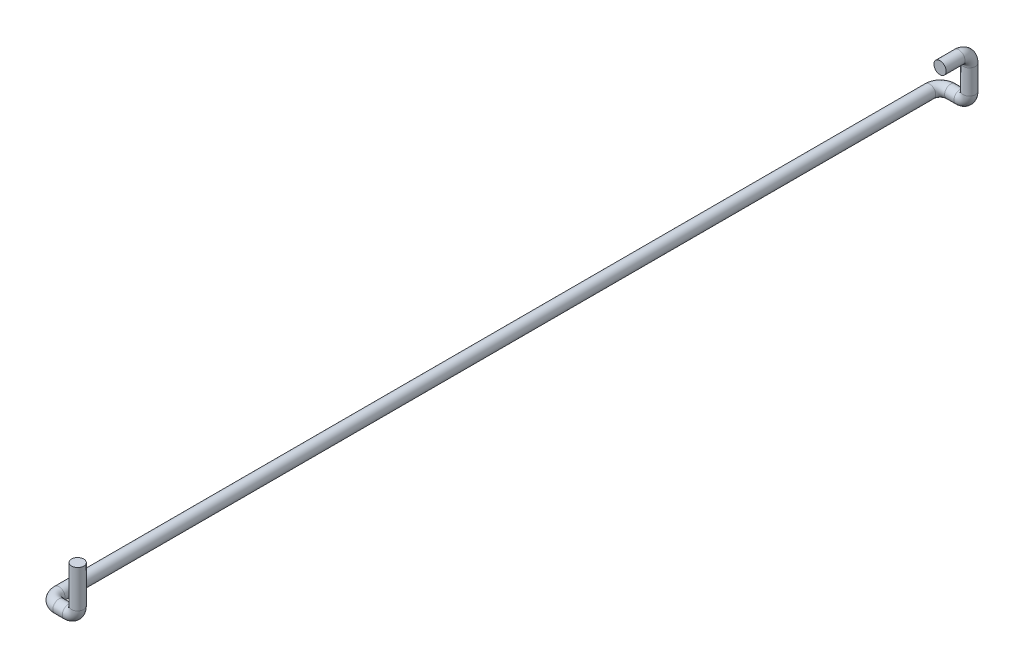
ISO-10303-21;
HEADER;
FILE_DESCRIPTION(('STEP AP214'),'2;1');
FILE_NAME('part.step','',(''),(''),'','','');
FILE_SCHEMA(('AUTOMOTIVE_DESIGN { 1 0 10303 214 1 1 1 1 }'));
ENDSEC;
DATA;
#1=APPLICATION_CONTEXT('core data for automotive mechanical design processes');
#2=APPLICATION_PROTOCOL_DEFINITION('international standard','automotive_design',2000,#1);
#3=PRODUCT_CONTEXT('',#1,'mechanical');
#4=PRODUCT('Part','Part','',(#3));
#5=PRODUCT_RELATED_PRODUCT_CATEGORY('part','',(#4));
#6=PRODUCT_DEFINITION_FORMATION('','',#4);
#7=PRODUCT_DEFINITION_CONTEXT('part definition',#1,'design');
#8=PRODUCT_DEFINITION('design','',#6,#7);
#9=PRODUCT_DEFINITION_SHAPE('','',#8);
#10=(LENGTH_UNIT() NAMED_UNIT(*) SI_UNIT(.MILLI.,.METRE.));
#11=(NAMED_UNIT(*) PLANE_ANGLE_UNIT() SI_UNIT($,.RADIAN.));
#12=(NAMED_UNIT(*) SI_UNIT($,.STERADIAN.) SOLID_ANGLE_UNIT());
#13=UNCERTAINTY_MEASURE_WITH_UNIT(LENGTH_MEASURE(1.E-05),#10,'distance_accuracy_value','');
#14=(GEOMETRIC_REPRESENTATION_CONTEXT(3) GLOBAL_UNCERTAINTY_ASSIGNED_CONTEXT((#13)) GLOBAL_UNIT_ASSIGNED_CONTEXT((#10,
#11,#12)) REPRESENTATION_CONTEXT('',''));
#15=CARTESIAN_POINT('',(0.,0.,0.));
#16=DIRECTION('',(0.,0.,1.));
#17=DIRECTION('',(1.,0.,0.));
#18=AXIS2_PLACEMENT_3D('',#15,#16,#17);
#19=CARTESIAN_POINT('',(0.,0.,5.55472846535674));
#20=DIRECTION('',(0.,0.,-1.));
#21=DIRECTION('',(-1.,0.,0.));
#22=AXIS2_PLACEMENT_3D('',#19,#20,#21);
#23=PLANE('',#22);
#24=CARTESIAN_POINT('',(0.,0.,5.55472846535674));
#25=DIRECTION('',(0.,0.,-1.));
#26=DIRECTION('',(0.,1.,0.));
#27=AXIS2_PLACEMENT_3D('',#24,#25,#26);
#28=CIRCLE('',#27,3.25);
#29=CARTESIAN_POINT('',(0.,3.25,5.55472846535674));
#30=VERTEX_POINT('',#29);
#31=EDGE_CURVE('E17',#30,#30,#28,.T.);
#32=ORIENTED_EDGE('',*,*,#31,.F.);
#33=EDGE_LOOP('',(#32));
#34=FACE_BOUND('',#33,.T.);
#35=ADVANCED_FACE('F14',(#34),#23,.F.);
#36=CARTESIAN_POINT('',(0.,0.,5.55472846535674));
#37=DIRECTION('',(0.,0.,-1.));
#38=DIRECTION('',(0.,1.,0.));
#39=AXIS2_PLACEMENT_3D('',#36,#37,#38);
#40=CYLINDRICAL_SURFACE('',#39,3.25);
#41=ORIENTED_EDGE('',*,*,#31,.T.);
#42=EDGE_LOOP('',(#41));
#43=FACE_BOUND('',#42,.T.);
#44=CARTESIAN_POINT('',(0.,0.,-4.44527153464326));
#45=DIRECTION('',(0.,0.,-1.));
#46=DIRECTION('',(0.,1.,0.));
#47=AXIS2_PLACEMENT_3D('',#44,#45,#46);
#48=CIRCLE('',#47,3.25);
#49=CARTESIAN_POINT('',(0.,3.25,-4.44527153464326));
#50=VERTEX_POINT('',#49);
#51=EDGE_CURVE('E101',#50,#50,#48,.T.);
#52=ORIENTED_EDGE('',*,*,#51,.F.);
#53=EDGE_LOOP('',(#52));
#54=FACE_BOUND('',#53,.T.);
#55=ADVANCED_FACE('F111',(#43,#54),#40,.T.);
#56=CARTESIAN_POINT('',(0.074465873559726,1.40322904277392,463.355728465357));
#57=DIRECTION('',(0.,1.,0.));
#58=DIRECTION('',(0.,0.,1.));
#59=AXIS2_PLACEMENT_3D('',#56,#57,#58);
#60=PLANE('',#59);
#61=CARTESIAN_POINT('',(0.,1.40322904277392,463.952499422583));
#62=DIRECTION('',(0.,1.,0.));
#63=DIRECTION('',(-1.,0.,0.));
#64=AXIS2_PLACEMENT_3D('',#61,#62,#63);
#65=CIRCLE('',#64,3.25);
#66=CARTESIAN_POINT('',(-3.24999999999998,1.40322904277392,463.952499422583));
#67=VERTEX_POINT('',#66);
#68=EDGE_CURVE('E96',#67,#67,#65,.F.);
#69=ORIENTED_EDGE('',*,*,#68,.F.);
#70=EDGE_LOOP('',(#69));
#71=FACE_BOUND('',#70,.T.);
#72=ADVANCED_FACE('F108',(#71),#60,.T.);
#73=CARTESIAN_POINT('',(0.,-5.59677095722604,-4.44527153464326));
#74=DIRECTION('',(-1.,0.,0.));
#75=DIRECTION('',(0.,0.,1.));
#76=AXIS2_PLACEMENT_3D('',#73,#74,#75);
#77=TOROIDAL_SURFACE('',#76,5.59677095722604,3.25);
#78=ORIENTED_EDGE('',*,*,#51,.T.);
#79=EDGE_LOOP('',(#78));
#80=FACE_BOUND('',#79,.T.);
#81=CARTESIAN_POINT('',(0.,-5.59677095722604,-10.0420424918693));
#82=DIRECTION('',(0.,-1.,0.));
#83=DIRECTION('',(0.,0.,-1.));
#84=AXIS2_PLACEMENT_3D('',#81,#82,#83);
#85=CIRCLE('',#84,3.25);
#86=CARTESIAN_POINT('',(0.,-5.59677095722604,-13.2920424918693));
#87=VERTEX_POINT('',#86);
#88=EDGE_CURVE('E91',#87,#87,#85,.T.);
#89=ORIENTED_EDGE('',*,*,#88,.F.);
#90=EDGE_LOOP('',(#89));
#91=FACE_BOUND('',#90,.T.);
#92=ADVANCED_FACE('F104',(#80,#91),#77,.T.);
#93=CARTESIAN_POINT('',(0.,-18.5967709572261,463.952499422583));
#94=DIRECTION('',(0.,1.,0.));
#95=DIRECTION('',(-1.,0.,0.));
#96=AXIS2_PLACEMENT_3D('',#93,#94,#95);
#97=CYLINDRICAL_SURFACE('',#96,3.25);
#98=CARTESIAN_POINT('',(0.,-18.5967709572261,463.952499422583));
#99=DIRECTION('',(0.,1.,0.));
#100=DIRECTION('',(1.,0.,0.));
#101=AXIS2_PLACEMENT_3D('',#98,#99,#100);
#102=CIRCLE('',#101,3.25);
#103=CARTESIAN_POINT('',(3.25000000000003,-18.5967709572261,463.952499422583));
#104=VERTEX_POINT('',#103);
#105=EDGE_CURVE('E88',#104,#104,#102,.F.);
#106=ORIENTED_EDGE('',*,*,#105,.F.);
#107=EDGE_LOOP('',(#106));
#108=FACE_BOUND('',#107,.T.);
#109=ORIENTED_EDGE('',*,*,#68,.T.);
#110=EDGE_LOOP('',(#109));
#111=FACE_BOUND('',#110,.T.);
#112=ADVANCED_FACE('F107',(#108,#111),#97,.T.);
#113=CARTESIAN_POINT('',(0.,-5.59677095722604,-10.0420424918693));
#114=DIRECTION('',(0.,-1.,0.));
#115=DIRECTION('',(0.,0.,-1.));
#116=AXIS2_PLACEMENT_3D('',#113,#114,#115);
#117=CYLINDRICAL_SURFACE('',#116,3.25);
#118=ORIENTED_EDGE('',*,*,#88,.T.);
#119=EDGE_LOOP('',(#118));
#120=FACE_BOUND('',#119,.T.);
#121=CARTESIAN_POINT('',(0.,-18.596770957226,-10.0420424918693));
#122=DIRECTION('',(0.,-1.,0.));
#123=DIRECTION('',(1.,0.,0.));
#124=AXIS2_PLACEMENT_3D('',#121,#122,#123);
#125=CIRCLE('',#124,3.25);
#126=CARTESIAN_POINT('',(3.25,-18.596770957226,-10.0420424918693));
#127=VERTEX_POINT('',#126);
#128=EDGE_CURVE('E66',#127,#127,#125,.T.);
#129=ORIENTED_EDGE('',*,*,#128,.F.);
#130=EDGE_LOOP('',(#129));
#131=FACE_BOUND('',#130,.T.);
#132=ADVANCED_FACE('F82',(#120,#131),#117,.T.);
#133=CARTESIAN_POINT('',(-4.92553412644027,-18.5967709572261,463.952499422583));
#134=DIRECTION('',(0.,0.,1.));
#135=DIRECTION('',(1.,0.,0.));
#136=AXIS2_PLACEMENT_3D('',#133,#134,#135);
#137=TOROIDAL_SURFACE('',#136,4.9255341264403,3.25);
#138=CARTESIAN_POINT('',(-4.92553412644029,-23.5223050836664,463.952499422583));
#139=DIRECTION('',(1.,0.,0.));
#140=DIRECTION('',(0.,1.,0.));
#141=AXIS2_PLACEMENT_3D('',#138,#139,#140);
#142=CIRCLE('',#141,3.25);
#143=CARTESIAN_POINT('',(-4.92553412644029,-20.2723050836664,463.952499422583));
#144=VERTEX_POINT('',#143);
#145=EDGE_CURVE('E61',#144,#144,#142,.F.);
#146=ORIENTED_EDGE('',*,*,#145,.F.);
#147=EDGE_LOOP('',(#146));
#148=FACE_BOUND('',#147,.T.);
#149=ORIENTED_EDGE('',*,*,#105,.T.);
#150=EDGE_LOOP('',(#149));
#151=FACE_BOUND('',#150,.T.);
#152=ADVANCED_FACE('F77',(#148,#151),#137,.T.);
#153=CARTESIAN_POINT('',(-4.9255341264403,-18.596770957226,-10.0420424918693));
#154=DIRECTION('',(0.,0.,-1.));
#155=DIRECTION('',(-1.,0.,0.));
#156=AXIS2_PLACEMENT_3D('',#153,#154,#155);
#157=TOROIDAL_SURFACE('',#156,4.9255341264403,3.25);
#158=ORIENTED_EDGE('',*,*,#128,.T.);
#159=EDGE_LOOP('',(#158));
#160=FACE_BOUND('',#159,.T.);
#161=CARTESIAN_POINT('',(-4.9255341264403,-23.5223050836663,-10.0420424918693));
#162=DIRECTION('',(-1.,0.,0.));
#163=DIRECTION('',(0.,-1.,0.));
#164=AXIS2_PLACEMENT_3D('',#161,#162,#163);
#165=CIRCLE('',#164,3.25);
#166=CARTESIAN_POINT('',(-4.92553412644031,-26.7723050836663,-10.0420424918693));
#167=VERTEX_POINT('',#166);
#168=EDGE_CURVE('E56',#167,#167,#165,.T.);
#169=ORIENTED_EDGE('',*,*,#168,.F.);
#170=EDGE_LOOP('',(#169));
#171=FACE_BOUND('',#170,.T.);
#172=ADVANCED_FACE('F73',(#160,#171),#157,.T.);
#173=CARTESIAN_POINT('',(-9.92553412644028,-23.5223050836664,463.952499422583));
#174=DIRECTION('',(1.,0.,0.));
#175=DIRECTION('',(0.,1.,0.));
#176=AXIS2_PLACEMENT_3D('',#173,#174,#175);
#177=CYLINDRICAL_SURFACE('',#176,3.25);
#178=CARTESIAN_POINT('',(-9.92553412644027,-23.5223050836664,463.952499422583));
#179=DIRECTION('',(1.,0.,0.));
#180=DIRECTION('',(0.,0.,1.));
#181=AXIS2_PLACEMENT_3D('',#178,#179,#180);
#182=CIRCLE('',#181,3.25);
#183=CARTESIAN_POINT('',(-9.92553412644027,-23.5223050836664,467.202499422583));
#184=VERTEX_POINT('',#183);
#185=EDGE_CURVE('E53',#184,#184,#182,.F.);
#186=ORIENTED_EDGE('',*,*,#185,.F.);
#187=EDGE_LOOP('',(#186));
#188=FACE_BOUND('',#187,.T.);
#189=ORIENTED_EDGE('',*,*,#145,.T.);
#190=EDGE_LOOP('',(#189));
#191=FACE_BOUND('',#190,.T.);
#192=ADVANCED_FACE('F76',(#188,#191),#177,.T.);
#193=CARTESIAN_POINT('',(-4.92553412644031,-23.5223050836663,-10.0420424918693));
#194=DIRECTION('',(-1.,0.,0.));
#195=DIRECTION('',(0.,-1.,0.));
#196=AXIS2_PLACEMENT_3D('',#193,#194,#195);
#197=CYLINDRICAL_SURFACE('',#196,3.25);
#198=ORIENTED_EDGE('',*,*,#168,.T.);
#199=EDGE_LOOP('',(#198));
#200=FACE_BOUND('',#199,.T.);
#201=CARTESIAN_POINT('',(-9.9255341264403,-23.5223050836663,-10.0420424918693));
#202=DIRECTION('',(-1.,0.,0.));
#203=DIRECTION('',(0.,0.,-1.));
#204=AXIS2_PLACEMENT_3D('',#201,#202,#203);
#205=CIRCLE('',#204,3.25);
#206=CARTESIAN_POINT('',(-9.9255341264403,-23.5223050836663,-13.2920424918693));
#207=VERTEX_POINT('',#206);
#208=EDGE_CURVE('E26',#207,#207,#205,.T.);
#209=ORIENTED_EDGE('',*,*,#208,.F.);
#210=EDGE_LOOP('',(#209));
#211=FACE_BOUND('',#210,.T.);
#212=ADVANCED_FACE('F47',(#200,#211),#197,.T.);
#213=CARTESIAN_POINT('',(-9.92553412644027,-23.5223050836664,458.355728465357));
#214=DIRECTION('',(0.,1.,0.));
#215=DIRECTION('',(0.,0.,1.));
#216=AXIS2_PLACEMENT_3D('',#213,#214,#215);
#217=TOROIDAL_SURFACE('',#216,5.59677095722605,3.25);
#218=CARTESIAN_POINT('',(-15.5223050836663,-23.5223050836664,458.355728465357));
#219=DIRECTION('',(0.,0.,1.));
#220=DIRECTION('',(0.,-1.,0.));
#221=AXIS2_PLACEMENT_3D('',#218,#219,#220);
#222=CIRCLE('',#221,3.25);
#223=CARTESIAN_POINT('',(-15.5223050836663,-26.7723050836664,458.355728465357));
#224=VERTEX_POINT('',#223);
#225=EDGE_CURVE('E21',#224,#224,#222,.F.);
#226=ORIENTED_EDGE('',*,*,#225,.F.);
#227=EDGE_LOOP('',(#226));
#228=FACE_BOUND('',#227,.T.);
#229=ORIENTED_EDGE('',*,*,#185,.T.);
#230=EDGE_LOOP('',(#229));
#231=FACE_BOUND('',#230,.T.);
#232=ADVANCED_FACE('F42',(#228,#231),#217,.T.);
#233=CARTESIAN_POINT('',(-9.9255341264403,-23.5223050836663,-4.44527153464326));
#234=DIRECTION('',(0.,1.,0.));
#235=DIRECTION('',(0.,0.,1.));
#236=AXIS2_PLACEMENT_3D('',#233,#234,#235);
#237=TOROIDAL_SURFACE('',#236,5.59677095722604,3.25);
#238=ORIENTED_EDGE('',*,*,#208,.T.);
#239=EDGE_LOOP('',(#238));
#240=FACE_BOUND('',#239,.T.);
#241=CARTESIAN_POINT('',(-15.5223050836663,-23.5223050836663,-4.44527153464326));
#242=DIRECTION('',(0.,0.,1.));
#243=DIRECTION('',(0.,-1.,0.));
#244=AXIS2_PLACEMENT_3D('',#241,#242,#243);
#245=CIRCLE('',#244,3.25);
#246=CARTESIAN_POINT('',(-15.5223050836663,-26.7723050836663,-4.44527153464326));
#247=VERTEX_POINT('',#246);
#248=EDGE_CURVE('E9',#247,#247,#245,.T.);
#249=ORIENTED_EDGE('',*,*,#248,.F.);
#250=EDGE_LOOP('',(#249));
#251=FACE_BOUND('',#250,.T.);
#252=ADVANCED_FACE('F37',(#240,#251),#237,.T.);
#253=CARTESIAN_POINT('',(-15.5223050836663,-23.5223050836663,-4.44527153464326));
#254=DIRECTION('',(0.,0.,1.));
#255=DIRECTION('',(0.,-1.,0.));
#256=AXIS2_PLACEMENT_3D('',#253,#254,#255);
#257=CYLINDRICAL_SURFACE('',#256,3.25);
#258=ORIENTED_EDGE('',*,*,#248,.T.);
#259=EDGE_LOOP('',(#258));
#260=FACE_BOUND('',#259,.T.);
#261=ORIENTED_EDGE('',*,*,#225,.T.);
#262=EDGE_LOOP('',(#261));
#263=FACE_BOUND('',#262,.T.);
#264=ADVANCED_FACE('F41',(#260,#263),#257,.T.);
#265=CLOSED_SHELL('',(#35,#55,#72,#92,#112,#132,#152,#172,#192,#212,#232,#252,#264));
#266=MANIFOLD_SOLID_BREP('B1',#265);
#267=ADVANCED_BREP_SHAPE_REPRESENTATION('',(#18,#266),#14);
#268=SHAPE_DEFINITION_REPRESENTATION(#9,#267);
ENDSEC;
END-ISO-10303-21;
